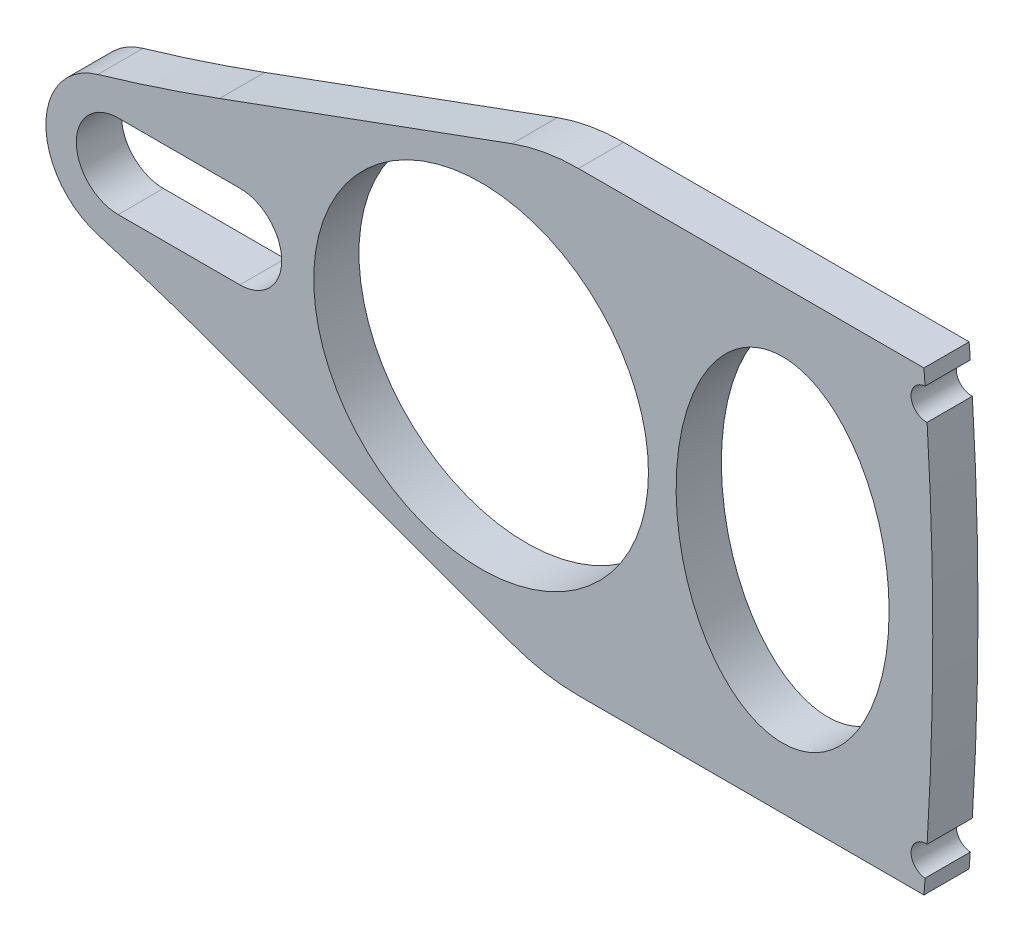
ISO-10303-21;
HEADER;
FILE_DESCRIPTION(('STEP AP214'),'2;1');
FILE_NAME('part.step','',(''),(''),'','','');
FILE_SCHEMA(('AUTOMOTIVE_DESIGN { 1 0 10303 214 1 1 1 1 }'));
ENDSEC;
DATA;
#1=APPLICATION_CONTEXT('core data for automotive mechanical design processes');
#2=APPLICATION_PROTOCOL_DEFINITION('international standard','automotive_design',2000,#1);
#3=PRODUCT_CONTEXT('',#1,'mechanical');
#4=PRODUCT('Part','Part','',(#3));
#5=PRODUCT_RELATED_PRODUCT_CATEGORY('part','',(#4));
#6=PRODUCT_DEFINITION_FORMATION('','',#4);
#7=PRODUCT_DEFINITION_CONTEXT('part definition',#1,'design');
#8=PRODUCT_DEFINITION('design','',#6,#7);
#9=PRODUCT_DEFINITION_SHAPE('','',#8);
#10=(LENGTH_UNIT() NAMED_UNIT(*) SI_UNIT(.MILLI.,.METRE.));
#11=(NAMED_UNIT(*) PLANE_ANGLE_UNIT() SI_UNIT($,.RADIAN.));
#12=(NAMED_UNIT(*) SI_UNIT($,.STERADIAN.) SOLID_ANGLE_UNIT());
#13=UNCERTAINTY_MEASURE_WITH_UNIT(LENGTH_MEASURE(1.E-05),#10,'distance_accuracy_value','');
#14=(GEOMETRIC_REPRESENTATION_CONTEXT(3) GLOBAL_UNCERTAINTY_ASSIGNED_CONTEXT((#13)) GLOBAL_UNIT_ASSIGNED_CONTEXT((#10,
#11,#12)) REPRESENTATION_CONTEXT('',''));
#15=CARTESIAN_POINT('',(0.,0.,0.));
#16=DIRECTION('',(0.,0.,1.));
#17=DIRECTION('',(1.,0.,0.));
#18=AXIS2_PLACEMENT_3D('',#15,#16,#17);
#19=CARTESIAN_POINT('',(-7.77682333330338,-8.0786097532659,3.));
#20=DIRECTION('',(0.,0.,1.));
#21=DIRECTION('',(1.,0.,0.));
#22=AXIS2_PLACEMENT_3D('',#19,#20,#21);
#23=PLANE('',#22);
#24=CARTESIAN_POINT('',(-37.3047240677879,5.04690601078956,3.));
#25=DIRECTION('',(0.,0.,1.));
#26=DIRECTION('',(1.,0.,0.));
#27=AXIS2_PLACEMENT_3D('',#24,#25,#26);
#28=CIRCLE('',#27,11.101085899709);
#29=CARTESIAN_POINT('',(-26.2036381680789,5.04690601078956,3.));
#30=VERTEX_POINT('',#29);
#31=EDGE_CURVE('E449',#30,#30,#28,.T.);
#32=ORIENTED_EDGE('',*,*,#31,.F.);
#33=EDGE_LOOP('',(#32));
#34=FACE_BOUND('',#33,.T.);
#35=CARTESIAN_POINT('',(-7.77682333330338,-8.0786097532659,3.));
#36=DIRECTION('',(0.,0.,-1.));
#37=DIRECTION('',(1.,0.,0.));
#38=AXIS2_PLACEMENT_3D('',#35,#36,#37);
#39=CIRCLE('',#38,1.00918962724762);
#40=CARTESIAN_POINT('',(-7.85750176930204,-9.08456934177281,3.));
#41=VERTEX_POINT('',#40);
#42=CARTESIAN_POINT('',(-7.72211277540641,-7.07090421165226,3.));
#43=VERTEX_POINT('',#42);
#44=EDGE_CURVE('E360',#41,#43,#39,.T.);
#45=ORIENTED_EDGE('',*,*,#44,.T.);
#46=CARTESIAN_POINT('',(-202.995006498992,5.04690601078679,3.));
#47=DIRECTION('',(0.,0.,1.));
#48=DIRECTION('',(1.,0.,0.));
#49=AXIS2_PLACEMENT_3D('',#46,#47,#48);
#50=CIRCLE('',#49,195.64852247786);
#51=CARTESIAN_POINT('',(-7.72211277540656,17.1647162332286,3.));
#52=VERTEX_POINT('',#51);
#53=EDGE_CURVE('E439',#43,#52,#50,.T.);
#54=ORIENTED_EDGE('',*,*,#53,.T.);
#55=CARTESIAN_POINT('',(-7.77682333329522,18.1724217748454,3.));
#56=DIRECTION('',(0.,0.,-1.));
#57=DIRECTION('',(1.,0.,0.));
#58=AXIS2_PLACEMENT_3D('',#55,#56,#57);
#59=CIRCLE('',#58,1.00918962725036);
#60=CARTESIAN_POINT('',(-7.85750176930147,19.178381363334,3.));
#61=VERTEX_POINT('',#60);
#62=EDGE_CURVE('E436',#52,#61,#59,.T.);
#63=ORIENTED_EDGE('',*,*,#62,.T.);
#64=CARTESIAN_POINT('',(-202.995006498992,5.04690601077163,3.));
#65=DIRECTION('',(0.,0.,1.));
#66=DIRECTION('',(1.,0.,0.));
#67=AXIS2_PLACEMENT_3D('',#64,#65,#66);
#68=CIRCLE('',#67,195.648522477861);
#69=CARTESIAN_POINT('',(-7.93299068241115,20.1847504194836,3.));
#70=VERTEX_POINT('',#69);
#71=EDGE_CURVE('E316',#61,#70,#68,.T.);
#72=ORIENTED_EDGE('',*,*,#71,.T.);
#73=DIRECTION('',(-1.,0.,0.));
#74=VECTOR('',#73,1.);
#75=CARTESIAN_POINT('',(-7.93299068241115,20.1847504194836,3.));
#76=LINE('',#75,#74);
#77=CARTESIAN_POINT('',(-30.8487465878263,20.1847504194836,3.));
#78=VERTEX_POINT('',#77);
#79=EDGE_CURVE('E431',#70,#78,#76,.T.);
#80=ORIENTED_EDGE('',*,*,#79,.T.);
#81=CARTESIAN_POINT('',(-30.8487465878263,7.36804215345589,3.));
#82=DIRECTION('',(0.,0.,1.));
#83=DIRECTION('',(1.,0.,0.));
#84=AXIS2_PLACEMENT_3D('',#81,#82,#83);
#85=CIRCLE('',#84,12.8167082660278);
#86=CARTESIAN_POINT('',(-35.2546423511581,19.4036598484111,3.));
#87=VERTEX_POINT('',#86);
#88=EDGE_CURVE('E428',#78,#87,#85,.T.);
#89=ORIENTED_EDGE('',*,*,#88,.T.);
#90=DIRECTION('',(-0.939056850256716,-0.343761882683254,0.));
#91=VECTOR('',#90,1.);
#92=CARTESIAN_POINT('',(-35.2546423511581,19.4036598484111,3.));
#93=LINE('',#92,#91);
#94=CARTESIAN_POINT('',(-54.6534028909149,12.3023278651074,3.));
#95=VERTEX_POINT('',#94);
#96=EDGE_CURVE('E425',#87,#95,#93,.T.);
#97=ORIENTED_EDGE('',*,*,#96,.T.);
#98=CARTESIAN_POINT('',(-98.7123605242326,132.658504814659,3.));
#99=DIRECTION('',(0.,0.,-1.));
#100=DIRECTION('',(1.,0.,0.));
#101=AXIS2_PLACEMENT_3D('',#98,#99,#100);
#102=CIRCLE('',#101,128.167082660277);
#103=CARTESIAN_POINT('',(-62.7242529820219,9.64770369062547,3.));
#104=VERTEX_POINT('',#103);
#105=EDGE_CURVE('E422',#95,#104,#102,.T.);
#106=ORIENTED_EDGE('',*,*,#105,.T.);
#107=CARTESIAN_POINT('',(-61.3782410857581,5.04690601078956,3.));
#108=DIRECTION('',(0.,0.,1.));
#109=DIRECTION('',(1.,0.,0.));
#110=AXIS2_PLACEMENT_3D('',#107,#108,#109);
#111=CIRCLE('',#110,4.79365072941982);
#112=CARTESIAN_POINT('',(-62.7242529820219,0.446108330953654,3.));
#113=VERTEX_POINT('',#112);
#114=EDGE_CURVE('E419',#104,#113,#111,.T.);
#115=ORIENTED_EDGE('',*,*,#114,.T.);
#116=CARTESIAN_POINT('',(-98.7123605242318,-122.56469279308,3.));
#117=DIRECTION('',(0.,0.,-1.));
#118=DIRECTION('',(1.,0.,0.));
#119=AXIS2_PLACEMENT_3D('',#116,#117,#118);
#120=CIRCLE('',#119,128.167082660277);
#121=CARTESIAN_POINT('',(-54.6534028909135,-2.20851584352876,3.));
#122=VERTEX_POINT('',#121);
#123=EDGE_CURVE('E416',#113,#122,#120,.T.);
#124=ORIENTED_EDGE('',*,*,#123,.T.);
#125=DIRECTION('',(0.939056850256712,-0.343761882683264,0.));
#126=VECTOR('',#125,1.);
#127=CARTESIAN_POINT('',(-54.6534028909135,-2.20851584352876,3.));
#128=LINE('',#127,#126);
#129=CARTESIAN_POINT('',(-35.2546423511581,-9.30984782683213,3.));
#130=VERTEX_POINT('',#129);
#131=EDGE_CURVE('E413',#122,#130,#128,.T.);
#132=ORIENTED_EDGE('',*,*,#131,.T.);
#133=CARTESIAN_POINT('',(-30.8487465878263,2.72576986812301,3.));
#134=DIRECTION('',(0.,0.,1.));
#135=DIRECTION('',(1.,0.,0.));
#136=AXIS2_PLACEMENT_3D('',#133,#134,#135);
#137=CIRCLE('',#136,12.8167082660277);
#138=CARTESIAN_POINT('',(-30.8487465878263,-10.0909383979047,3.));
#139=VERTEX_POINT('',#138);
#140=EDGE_CURVE('E410',#130,#139,#137,.T.);
#141=ORIENTED_EDGE('',*,*,#140,.T.);
#142=DIRECTION('',(1.,0.,0.));
#143=VECTOR('',#142,1.);
#144=CARTESIAN_POINT('',(-30.8487465878263,-10.0909383979047,3.));
#145=LINE('',#144,#143);
#146=CARTESIAN_POINT('',(-7.93299068241127,-10.0909383979048,3.));
#147=VERTEX_POINT('',#146);
#148=EDGE_CURVE('E407',#139,#147,#145,.T.);
#149=ORIENTED_EDGE('',*,*,#148,.T.);
#150=CARTESIAN_POINT('',(-202.995006498992,5.04690601078939,3.));
#151=DIRECTION('',(0.,0.,1.));
#152=DIRECTION('',(1.,0.,0.));
#153=AXIS2_PLACEMENT_3D('',#150,#151,#152);
#154=CIRCLE('',#153,195.64852247786);
#155=EDGE_CURVE('E366',#147,#41,#154,.T.);
#156=ORIENTED_EDGE('',*,*,#155,.T.);
#157=EDGE_LOOP('',(#45,#54,#63,#72,#80,#89,#97,#106,#115,#124,#132,#141,#149,#156));
#158=FACE_BOUND('',#157,.T.);
#159=CARTESIAN_POINT('',(-17.3047240677879,5.04690601078956,3.));
#160=DIRECTION('',(0.,0.,1.));
#161=DIRECTION('',(0.,-1.,0.));
#162=AXIS2_PLACEMENT_3D('',#159,#160,#161);
#163=ELLIPSE('',#162,11.101085899709,7.06432739072393);
#164=CARTESIAN_POINT('',(-17.3047240677879,-6.05417988891948,3.));
#165=VERTEX_POINT('',#164);
#166=EDGE_CURVE('E219',#165,#165,#163,.T.);
#167=ORIENTED_EDGE('',*,*,#166,.F.);
#168=EDGE_LOOP('',(#167));
#169=FACE_BOUND('',#168,.T.);
#170=DIRECTION('',(-1.,0.,0.));
#171=VECTOR('',#170,1.);
#172=CARTESIAN_POINT('',(-61.3782410857581,7.82217748571684,3.));
#173=LINE('',#172,#171);
#174=CARTESIAN_POINT('',(-53.3047240677879,7.82217748571684,3.));
#175=VERTEX_POINT('',#174);
#176=CARTESIAN_POINT('',(-61.3782410857581,7.82217748571682,3.));
#177=VERTEX_POINT('',#176);
#178=EDGE_CURVE('E180',#175,#177,#173,.T.);
#179=ORIENTED_EDGE('',*,*,#178,.F.);
#180=CARTESIAN_POINT('',(-53.3047240677879,5.04690601078958,3.));
#181=DIRECTION('',(0.,0.,1.));
#182=DIRECTION('',(1.,0.,0.));
#183=AXIS2_PLACEMENT_3D('',#180,#181,#182);
#184=CIRCLE('',#183,2.77527147492728);
#185=CARTESIAN_POINT('',(-53.3047240677879,2.27163453586227,3.));
#186=VERTEX_POINT('',#185);
#187=EDGE_CURVE('E171',#186,#175,#184,.T.);
#188=ORIENTED_EDGE('',*,*,#187,.F.);
#189=DIRECTION('',(1.,0.,0.));
#190=VECTOR('',#189,1.);
#191=CARTESIAN_POINT('',(-53.3047240677879,2.27163453586227,3.));
#192=LINE('',#191,#190);
#193=CARTESIAN_POINT('',(-61.3782410857581,2.27163453586227,3.));
#194=VERTEX_POINT('',#193);
#195=EDGE_CURVE('E197',#194,#186,#192,.T.);
#196=ORIENTED_EDGE('',*,*,#195,.F.);
#197=CARTESIAN_POINT('',(-61.3782410857581,5.04690601078953,3.));
#198=DIRECTION('',(0.,0.,1.));
#199=DIRECTION('',(1.,0.,0.));
#200=AXIS2_PLACEMENT_3D('',#197,#198,#199);
#201=CIRCLE('',#200,2.77527147492728);
#202=EDGE_CURVE('E193',#177,#194,#201,.T.);
#203=ORIENTED_EDGE('',*,*,#202,.F.);
#204=EDGE_LOOP('',(#179,#188,#196,#203));
#205=FACE_BOUND('',#204,.T.);
#206=ADVANCED_FACE('F45',(#34,#158,#169,#205),#23,.T.);
#207=CARTESIAN_POINT('',(-7.77682333330338,-8.0786097532659,0.));
#208=DIRECTION('',(0.,0.,1.));
#209=DIRECTION('',(1.,0.,0.));
#210=AXIS2_PLACEMENT_3D('',#207,#208,#209);
#211=PLANE('',#210);
#212=CARTESIAN_POINT('',(-17.3047240677879,5.04690601078956,0.));
#213=DIRECTION('',(0.,0.,1.));
#214=DIRECTION('',(0.,-1.,0.));
#215=AXIS2_PLACEMENT_3D('',#212,#213,#214);
#216=ELLIPSE('',#215,11.101085899709,7.06432739072393);
#217=CARTESIAN_POINT('',(-17.3047240677879,-6.05417988891948,0.));
#218=VERTEX_POINT('',#217);
#219=EDGE_CURVE('E189',#218,#218,#216,.T.);
#220=ORIENTED_EDGE('',*,*,#219,.T.);
#221=EDGE_LOOP('',(#220));
#222=FACE_BOUND('',#221,.T.);
#223=CARTESIAN_POINT('',(-37.3047240677879,5.04690601078956,0.));
#224=DIRECTION('',(0.,0.,1.));
#225=DIRECTION('',(1.,0.,0.));
#226=AXIS2_PLACEMENT_3D('',#223,#224,#225);
#227=CIRCLE('',#226,11.101085899709);
#228=CARTESIAN_POINT('',(-26.2036381680789,5.04690601078956,0.));
#229=VERTEX_POINT('',#228);
#230=EDGE_CURVE('E224',#229,#229,#227,.T.);
#231=ORIENTED_EDGE('',*,*,#230,.T.);
#232=EDGE_LOOP('',(#231));
#233=FACE_BOUND('',#232,.T.);
#234=CARTESIAN_POINT('',(-202.995006498992,5.04690601078679,0.));
#235=DIRECTION('',(0.,0.,1.));
#236=DIRECTION('',(1.,0.,0.));
#237=AXIS2_PLACEMENT_3D('',#234,#235,#236);
#238=CIRCLE('',#237,195.64852247786);
#239=CARTESIAN_POINT('',(-7.72211277540641,-7.07090421165226,0.));
#240=VERTEX_POINT('',#239);
#241=CARTESIAN_POINT('',(-7.72211277540656,17.1647162332286,0.));
#242=VERTEX_POINT('',#241);
#243=EDGE_CURVE('E312',#240,#242,#238,.T.);
#244=ORIENTED_EDGE('',*,*,#243,.F.);
#245=CARTESIAN_POINT('',(-7.77682333330339,-8.0786097532659,0.));
#246=DIRECTION('',(0.,0.,-1.));
#247=DIRECTION('',(1.,0.,0.));
#248=AXIS2_PLACEMENT_3D('',#245,#246,#247);
#249=CIRCLE('',#248,1.00918962724762);
#250=CARTESIAN_POINT('',(-7.85750176930204,-9.08456934177281,0.));
#251=VERTEX_POINT('',#250);
#252=EDGE_CURVE('E357',#251,#240,#249,.T.);
#253=ORIENTED_EDGE('',*,*,#252,.F.);
#254=CARTESIAN_POINT('',(-202.995006498992,5.04690601078939,0.));
#255=DIRECTION('',(0.,0.,1.));
#256=DIRECTION('',(1.,0.,0.));
#257=AXIS2_PLACEMENT_3D('',#254,#255,#256);
#258=CIRCLE('',#257,195.64852247786);
#259=CARTESIAN_POINT('',(-7.93299068241127,-10.0909383979048,0.));
#260=VERTEX_POINT('',#259);
#261=EDGE_CURVE('E354',#260,#251,#258,.T.);
#262=ORIENTED_EDGE('',*,*,#261,.F.);
#263=DIRECTION('',(1.,0.,0.));
#264=VECTOR('',#263,1.);
#265=CARTESIAN_POINT('',(-30.8487465878263,-10.0909383979047,0.));
#266=LINE('',#265,#264);
#267=CARTESIAN_POINT('',(-30.8487465878263,-10.0909383979047,0.));
#268=VERTEX_POINT('',#267);
#269=EDGE_CURVE('E351',#268,#260,#266,.T.);
#270=ORIENTED_EDGE('',*,*,#269,.F.);
#271=CARTESIAN_POINT('',(-30.8487465878263,2.72576986812301,0.));
#272=DIRECTION('',(0.,0.,1.));
#273=DIRECTION('',(1.,0.,0.));
#274=AXIS2_PLACEMENT_3D('',#271,#272,#273);
#275=CIRCLE('',#274,12.8167082660277);
#276=CARTESIAN_POINT('',(-35.2546423511581,-9.30984782683213,0.));
#277=VERTEX_POINT('',#276);
#278=EDGE_CURVE('E348',#277,#268,#275,.T.);
#279=ORIENTED_EDGE('',*,*,#278,.F.);
#280=DIRECTION('',(0.939056850256712,-0.343761882683264,0.));
#281=VECTOR('',#280,1.);
#282=CARTESIAN_POINT('',(-54.6534028909135,-2.20851584352876,0.));
#283=LINE('',#282,#281);
#284=CARTESIAN_POINT('',(-54.6534028909135,-2.20851584352876,0.));
#285=VERTEX_POINT('',#284);
#286=EDGE_CURVE('E345',#285,#277,#283,.T.);
#287=ORIENTED_EDGE('',*,*,#286,.F.);
#288=CARTESIAN_POINT('',(-98.7123605242318,-122.56469279308,0.));
#289=DIRECTION('',(0.,0.,-1.));
#290=DIRECTION('',(1.,0.,0.));
#291=AXIS2_PLACEMENT_3D('',#288,#289,#290);
#292=CIRCLE('',#291,128.167082660277);
#293=CARTESIAN_POINT('',(-62.7242529820219,0.446108330953654,0.));
#294=VERTEX_POINT('',#293);
#295=EDGE_CURVE('E342',#294,#285,#292,.T.);
#296=ORIENTED_EDGE('',*,*,#295,.F.);
#297=CARTESIAN_POINT('',(-61.3782410857581,5.04690601078956,0.));
#298=DIRECTION('',(0.,0.,1.));
#299=DIRECTION('',(1.,0.,0.));
#300=AXIS2_PLACEMENT_3D('',#297,#298,#299);
#301=CIRCLE('',#300,4.79365072941982);
#302=CARTESIAN_POINT('',(-62.7242529820219,9.64770369062547,0.));
#303=VERTEX_POINT('',#302);
#304=EDGE_CURVE('E339',#303,#294,#301,.T.);
#305=ORIENTED_EDGE('',*,*,#304,.F.);
#306=CARTESIAN_POINT('',(-98.7123605242326,132.658504814659,0.));
#307=DIRECTION('',(0.,0.,-1.));
#308=DIRECTION('',(1.,0.,0.));
#309=AXIS2_PLACEMENT_3D('',#306,#307,#308);
#310=CIRCLE('',#309,128.167082660277);
#311=CARTESIAN_POINT('',(-54.6534028909149,12.3023278651074,0.));
#312=VERTEX_POINT('',#311);
#313=EDGE_CURVE('E336',#312,#303,#310,.T.);
#314=ORIENTED_EDGE('',*,*,#313,.F.);
#315=DIRECTION('',(-0.939056850256716,-0.343761882683254,0.));
#316=VECTOR('',#315,1.);
#317=CARTESIAN_POINT('',(-35.2546423511581,19.4036598484111,0.));
#318=LINE('',#317,#316);
#319=CARTESIAN_POINT('',(-35.2546423511581,19.4036598484111,0.));
#320=VERTEX_POINT('',#319);
#321=EDGE_CURVE('E333',#320,#312,#318,.T.);
#322=ORIENTED_EDGE('',*,*,#321,.F.);
#323=CARTESIAN_POINT('',(-30.8487465878263,7.36804215345589,0.));
#324=DIRECTION('',(0.,0.,1.));
#325=DIRECTION('',(1.,0.,0.));
#326=AXIS2_PLACEMENT_3D('',#323,#324,#325);
#327=CIRCLE('',#326,12.8167082660278);
#328=CARTESIAN_POINT('',(-30.8487465878263,20.1847504194836,0.));
#329=VERTEX_POINT('',#328);
#330=EDGE_CURVE('E327',#329,#320,#327,.T.);
#331=ORIENTED_EDGE('',*,*,#330,.F.);
#332=DIRECTION('',(-1.,0.,0.));
#333=VECTOR('',#332,1.);
#334=CARTESIAN_POINT('',(-7.93299068241115,20.1847504194836,0.));
#335=LINE('',#334,#333);
#336=CARTESIAN_POINT('',(-7.93299068241115,20.1847504194836,0.));
#337=VERTEX_POINT('',#336);
#338=EDGE_CURVE('E323',#337,#329,#335,.T.);
#339=ORIENTED_EDGE('',*,*,#338,.F.);
#340=CARTESIAN_POINT('',(-202.995006498992,5.04690601077163,0.));
#341=DIRECTION('',(0.,0.,1.));
#342=DIRECTION('',(1.,0.,0.));
#343=AXIS2_PLACEMENT_3D('',#340,#341,#342);
#344=CIRCLE('',#343,195.648522477861);
#345=CARTESIAN_POINT('',(-7.85750176930147,19.178381363334,0.));
#346=VERTEX_POINT('',#345);
#347=EDGE_CURVE('E311',#346,#337,#344,.T.);
#348=ORIENTED_EDGE('',*,*,#347,.F.);
#349=CARTESIAN_POINT('',(-7.77682333329873,18.1724217748274,0.));
#350=DIRECTION('',(0.,0.,-1.));
#351=DIRECTION('',(1.,0.,0.));
#352=AXIS2_PLACEMENT_3D('',#349,#350,#351);
#353=CIRCLE('',#352,1.00918962724768);
#354=EDGE_CURVE('E300',#242,#346,#353,.T.);
#355=ORIENTED_EDGE('',*,*,#354,.F.);
#356=EDGE_LOOP('',(#244,#253,#262,#270,#279,#287,#296,#305,#314,#322,#331,#339,#348,#355));
#357=FACE_BOUND('',#356,.T.);
#358=CARTESIAN_POINT('',(-53.3047240677879,5.04690601078958,0.));
#359=DIRECTION('',(0.,0.,1.));
#360=DIRECTION('',(1.,0.,0.));
#361=AXIS2_PLACEMENT_3D('',#358,#359,#360);
#362=CIRCLE('',#361,2.77527147492728);
#363=CARTESIAN_POINT('',(-53.3047240677879,2.27163453586227,0.));
#364=VERTEX_POINT('',#363);
#365=CARTESIAN_POINT('',(-53.3047240677879,7.82217748571684,0.));
#366=VERTEX_POINT('',#365);
#367=EDGE_CURVE('E69',#364,#366,#362,.T.);
#368=ORIENTED_EDGE('',*,*,#367,.T.);
#369=DIRECTION('',(-1.,0.,0.));
#370=VECTOR('',#369,1.);
#371=CARTESIAN_POINT('',(-61.3782410857581,7.82217748571684,0.));
#372=LINE('',#371,#370);
#373=CARTESIAN_POINT('',(-61.3782410857581,7.82217748571682,0.));
#374=VERTEX_POINT('',#373);
#375=EDGE_CURVE('E187',#366,#374,#372,.T.);
#376=ORIENTED_EDGE('',*,*,#375,.T.);
#377=CARTESIAN_POINT('',(-61.3782410857581,5.04690601078953,0.));
#378=DIRECTION('',(0.,0.,1.));
#379=DIRECTION('',(1.,0.,0.));
#380=AXIS2_PLACEMENT_3D('',#377,#378,#379);
#381=CIRCLE('',#380,2.77527147492728);
#382=CARTESIAN_POINT('',(-61.3782410857581,2.27163453586227,0.));
#383=VERTEX_POINT('',#382);
#384=EDGE_CURVE('E206',#374,#383,#381,.T.);
#385=ORIENTED_EDGE('',*,*,#384,.T.);
#386=DIRECTION('',(1.,0.,0.));
#387=VECTOR('',#386,1.);
#388=CARTESIAN_POINT('',(-53.3047240677879,2.27163453586227,0.));
#389=LINE('',#388,#387);
#390=EDGE_CURVE('E181',#383,#364,#389,.T.);
#391=ORIENTED_EDGE('',*,*,#390,.T.);
#392=EDGE_LOOP('',(#368,#376,#385,#391));
#393=FACE_BOUND('',#392,.T.);
#394=ADVANCED_FACE('F240',(#222,#233,#357,#393),#211,.F.);
#395=CARTESIAN_POINT('',(-202.995006498992,5.04690601078679,3.));
#396=DIRECTION('',(0.,0.,-1.));
#397=DIRECTION('',(-1.,0.,0.));
#398=AXIS2_PLACEMENT_3D('',#395,#396,#397);
#399=CYLINDRICAL_SURFACE('',#398,195.64852247786);
#400=ORIENTED_EDGE('',*,*,#243,.T.);
#401=DIRECTION('',(0.,0.,-1.));
#402=VECTOR('',#401,1.);
#403=CARTESIAN_POINT('',(-7.72211277540656,17.1647162332286,3.));
#404=LINE('',#403,#402);
#405=EDGE_CURVE('E54',#52,#242,#404,.T.);
#406=ORIENTED_EDGE('',*,*,#405,.F.);
#407=ORIENTED_EDGE('',*,*,#53,.F.);
#408=DIRECTION('',(0.,0.,-1.));
#409=VECTOR('',#408,1.);
#410=CARTESIAN_POINT('',(-7.72211277540641,-7.07090421165226,3.));
#411=LINE('',#410,#409);
#412=EDGE_CURVE('E11',#43,#240,#411,.T.);
#413=ORIENTED_EDGE('',*,*,#412,.T.);
#414=EDGE_LOOP('',(#400,#406,#407,#413));
#415=FACE_BOUND('',#414,.T.);
#416=ADVANCED_FACE('F47',(#415),#399,.T.);
#417=CARTESIAN_POINT('',(-7.77682333329873,18.1724217748274,3.));
#418=DIRECTION('',(0.,0.,-1.));
#419=DIRECTION('',(-1.,0.,0.));
#420=AXIS2_PLACEMENT_3D('',#417,#418,#419);
#421=CYLINDRICAL_SURFACE('',#420,1.00918962724768);
#422=ORIENTED_EDGE('',*,*,#354,.T.);
#423=DIRECTION('',(0.,0.,-1.));
#424=VECTOR('',#423,1.);
#425=CARTESIAN_POINT('',(-7.85750176930147,19.178381363334,3.));
#426=LINE('',#425,#424);
#427=EDGE_CURVE('E303',#61,#346,#426,.T.);
#428=ORIENTED_EDGE('',*,*,#427,.F.);
#429=ORIENTED_EDGE('',*,*,#62,.F.);
#430=ORIENTED_EDGE('',*,*,#405,.T.);
#431=EDGE_LOOP('',(#422,#428,#429,#430));
#432=FACE_BOUND('',#431,.T.);
#433=ADVANCED_FACE('F290',(#432),#421,.F.);
#434=CARTESIAN_POINT('',(-202.995006498992,5.04690601077163,3.));
#435=DIRECTION('',(0.,0.,-1.));
#436=DIRECTION('',(-1.,0.,0.));
#437=AXIS2_PLACEMENT_3D('',#434,#435,#436);
#438=CYLINDRICAL_SURFACE('',#437,195.648522477861);
#439=ORIENTED_EDGE('',*,*,#347,.T.);
#440=DIRECTION('',(0.,0.,-1.));
#441=VECTOR('',#440,1.);
#442=CARTESIAN_POINT('',(-7.93299068241115,20.1847504194836,3.));
#443=LINE('',#442,#441);
#444=EDGE_CURVE('E318',#70,#337,#443,.T.);
#445=ORIENTED_EDGE('',*,*,#444,.F.);
#446=ORIENTED_EDGE('',*,*,#71,.F.);
#447=ORIENTED_EDGE('',*,*,#427,.T.);
#448=EDGE_LOOP('',(#439,#445,#446,#447));
#449=FACE_BOUND('',#448,.T.);
#450=ADVANCED_FACE('F287',(#449),#438,.T.);
#451=CARTESIAN_POINT('',(-7.93299068241115,20.1847504194836,3.));
#452=DIRECTION('',(0.,-1.,0.));
#453=DIRECTION('',(0.,0.,-1.));
#454=AXIS2_PLACEMENT_3D('',#451,#452,#453);
#455=PLANE('',#454);
#456=ORIENTED_EDGE('',*,*,#338,.T.);
#457=DIRECTION('',(0.,0.,-1.));
#458=VECTOR('',#457,1.);
#459=CARTESIAN_POINT('',(-30.8487465878263,20.1847504194836,3.));
#460=LINE('',#459,#458);
#461=EDGE_CURVE('E398',#78,#329,#460,.T.);
#462=ORIENTED_EDGE('',*,*,#461,.F.);
#463=ORIENTED_EDGE('',*,*,#79,.F.);
#464=ORIENTED_EDGE('',*,*,#444,.T.);
#465=EDGE_LOOP('',(#456,#462,#463,#464));
#466=FACE_BOUND('',#465,.T.);
#467=ADVANCED_FACE('F283',(#466),#455,.F.);
#468=CARTESIAN_POINT('',(-30.8487465878263,7.36804215345589,3.));
#469=DIRECTION('',(0.,0.,-1.));
#470=DIRECTION('',(-1.,0.,0.));
#471=AXIS2_PLACEMENT_3D('',#468,#469,#470);
#472=CYLINDRICAL_SURFACE('',#471,12.8167082660278);
#473=ORIENTED_EDGE('',*,*,#330,.T.);
#474=DIRECTION('',(0.,0.,-1.));
#475=VECTOR('',#474,1.);
#476=CARTESIAN_POINT('',(-35.2546423511581,19.4036598484111,3.));
#477=LINE('',#476,#475);
#478=EDGE_CURVE('E394',#87,#320,#477,.T.);
#479=ORIENTED_EDGE('',*,*,#478,.F.);
#480=ORIENTED_EDGE('',*,*,#88,.F.);
#481=ORIENTED_EDGE('',*,*,#461,.T.);
#482=EDGE_LOOP('',(#473,#479,#480,#481));
#483=FACE_BOUND('',#482,.T.);
#484=ADVANCED_FACE('F279',(#483),#472,.T.);
#485=CARTESIAN_POINT('',(-35.2546423511581,19.4036598484111,3.));
#486=DIRECTION('',(0.343761882683254,-0.939056850256716,0.));
#487=DIRECTION('',(0.939056850256716,0.343761882683254,0.));
#488=AXIS2_PLACEMENT_3D('',#485,#486,#487);
#489=PLANE('',#488);
#490=ORIENTED_EDGE('',*,*,#321,.T.);
#491=DIRECTION('',(0.,0.,-1.));
#492=VECTOR('',#491,1.);
#493=CARTESIAN_POINT('',(-54.6534028909149,12.3023278651074,3.));
#494=LINE('',#493,#492);
#495=EDGE_CURVE('E390',#95,#312,#494,.T.);
#496=ORIENTED_EDGE('',*,*,#495,.F.);
#497=ORIENTED_EDGE('',*,*,#96,.F.);
#498=ORIENTED_EDGE('',*,*,#478,.T.);
#499=EDGE_LOOP('',(#490,#496,#497,#498));
#500=FACE_BOUND('',#499,.T.);
#501=ADVANCED_FACE('F275',(#500),#489,.F.);
#502=CARTESIAN_POINT('',(-98.7123605242326,132.658504814659,3.));
#503=DIRECTION('',(0.,0.,-1.));
#504=DIRECTION('',(-1.,0.,0.));
#505=AXIS2_PLACEMENT_3D('',#502,#503,#504);
#506=CYLINDRICAL_SURFACE('',#505,128.167082660277);
#507=ORIENTED_EDGE('',*,*,#313,.T.);
#508=DIRECTION('',(0.,0.,-1.));
#509=VECTOR('',#508,1.);
#510=CARTESIAN_POINT('',(-62.7242529820219,9.64770369062547,3.));
#511=LINE('',#510,#509);
#512=EDGE_CURVE('E386',#104,#303,#511,.T.);
#513=ORIENTED_EDGE('',*,*,#512,.F.);
#514=ORIENTED_EDGE('',*,*,#105,.F.);
#515=ORIENTED_EDGE('',*,*,#495,.T.);
#516=EDGE_LOOP('',(#507,#513,#514,#515));
#517=FACE_BOUND('',#516,.T.);
#518=ADVANCED_FACE('F271',(#517),#506,.F.);
#519=CARTESIAN_POINT('',(-61.3782410857581,5.04690601078956,3.));
#520=DIRECTION('',(0.,0.,-1.));
#521=DIRECTION('',(-1.,0.,0.));
#522=AXIS2_PLACEMENT_3D('',#519,#520,#521);
#523=CYLINDRICAL_SURFACE('',#522,4.79365072941982);
#524=ORIENTED_EDGE('',*,*,#304,.T.);
#525=DIRECTION('',(0.,0.,-1.));
#526=VECTOR('',#525,1.);
#527=CARTESIAN_POINT('',(-62.7242529820219,0.446108330953654,3.));
#528=LINE('',#527,#526);
#529=EDGE_CURVE('E382',#113,#294,#528,.T.);
#530=ORIENTED_EDGE('',*,*,#529,.F.);
#531=ORIENTED_EDGE('',*,*,#114,.F.);
#532=ORIENTED_EDGE('',*,*,#512,.T.);
#533=EDGE_LOOP('',(#524,#530,#531,#532));
#534=FACE_BOUND('',#533,.T.);
#535=ADVANCED_FACE('F267',(#534),#523,.T.);
#536=CARTESIAN_POINT('',(-98.7123605242318,-122.56469279308,3.));
#537=DIRECTION('',(0.,0.,-1.));
#538=DIRECTION('',(-1.,0.,0.));
#539=AXIS2_PLACEMENT_3D('',#536,#537,#538);
#540=CYLINDRICAL_SURFACE('',#539,128.167082660277);
#541=ORIENTED_EDGE('',*,*,#295,.T.);
#542=DIRECTION('',(0.,0.,-1.));
#543=VECTOR('',#542,1.);
#544=CARTESIAN_POINT('',(-54.6534028909135,-2.20851584352876,3.));
#545=LINE('',#544,#543);
#546=EDGE_CURVE('E378',#122,#285,#545,.T.);
#547=ORIENTED_EDGE('',*,*,#546,.F.);
#548=ORIENTED_EDGE('',*,*,#123,.F.);
#549=ORIENTED_EDGE('',*,*,#529,.T.);
#550=EDGE_LOOP('',(#541,#547,#548,#549));
#551=FACE_BOUND('',#550,.T.);
#552=ADVANCED_FACE('F263',(#551),#540,.F.);
#553=CARTESIAN_POINT('',(-54.6534028909135,-2.20851584352876,3.));
#554=DIRECTION('',(0.343761882683264,0.939056850256713,0.));
#555=DIRECTION('',(-0.939056850256713,0.343761882683264,0.));
#556=AXIS2_PLACEMENT_3D('',#553,#554,#555);
#557=PLANE('',#556);
#558=ORIENTED_EDGE('',*,*,#286,.T.);
#559=DIRECTION('',(0.,0.,-1.));
#560=VECTOR('',#559,1.);
#561=CARTESIAN_POINT('',(-35.2546423511581,-9.30984782683213,3.));
#562=LINE('',#561,#560);
#563=EDGE_CURVE('E374',#130,#277,#562,.T.);
#564=ORIENTED_EDGE('',*,*,#563,.F.);
#565=ORIENTED_EDGE('',*,*,#131,.F.);
#566=ORIENTED_EDGE('',*,*,#546,.T.);
#567=EDGE_LOOP('',(#558,#564,#565,#566));
#568=FACE_BOUND('',#567,.T.);
#569=ADVANCED_FACE('F259',(#568),#557,.F.);
#570=CARTESIAN_POINT('',(-30.8487465878263,2.72576986812301,3.));
#571=DIRECTION('',(0.,0.,-1.));
#572=DIRECTION('',(-1.,0.,0.));
#573=AXIS2_PLACEMENT_3D('',#570,#571,#572);
#574=CYLINDRICAL_SURFACE('',#573,12.8167082660277);
#575=ORIENTED_EDGE('',*,*,#278,.T.);
#576=DIRECTION('',(0.,0.,-1.));
#577=VECTOR('',#576,1.);
#578=CARTESIAN_POINT('',(-30.8487465878263,-10.0909383979047,3.));
#579=LINE('',#578,#577);
#580=EDGE_CURVE('E370',#139,#268,#579,.T.);
#581=ORIENTED_EDGE('',*,*,#580,.F.);
#582=ORIENTED_EDGE('',*,*,#140,.F.);
#583=ORIENTED_EDGE('',*,*,#563,.T.);
#584=EDGE_LOOP('',(#575,#581,#582,#583));
#585=FACE_BOUND('',#584,.T.);
#586=ADVANCED_FACE('F255',(#585),#574,.T.);
#587=CARTESIAN_POINT('',(-30.8487465878263,-10.0909383979047,3.));
#588=DIRECTION('',(0.,1.,0.));
#589=DIRECTION('',(0.,0.,1.));
#590=AXIS2_PLACEMENT_3D('',#587,#588,#589);
#591=PLANE('',#590);
#592=ORIENTED_EDGE('',*,*,#269,.T.);
#593=DIRECTION('',(0.,0.,-1.));
#594=VECTOR('',#593,1.);
#595=CARTESIAN_POINT('',(-7.93299068241127,-10.0909383979048,3.));
#596=LINE('',#595,#594);
#597=EDGE_CURVE('E365',#147,#260,#596,.T.);
#598=ORIENTED_EDGE('',*,*,#597,.F.);
#599=ORIENTED_EDGE('',*,*,#148,.F.);
#600=ORIENTED_EDGE('',*,*,#580,.T.);
#601=EDGE_LOOP('',(#592,#598,#599,#600));
#602=FACE_BOUND('',#601,.T.);
#603=ADVANCED_FACE('F251',(#602),#591,.F.);
#604=CARTESIAN_POINT('',(-202.995006498992,5.04690601078939,3.));
#605=DIRECTION('',(0.,0.,-1.));
#606=DIRECTION('',(-1.,0.,0.));
#607=AXIS2_PLACEMENT_3D('',#604,#605,#606);
#608=CYLINDRICAL_SURFACE('',#607,195.64852247786);
#609=ORIENTED_EDGE('',*,*,#261,.T.);
#610=DIRECTION('',(0.,0.,-1.));
#611=VECTOR('',#610,1.);
#612=CARTESIAN_POINT('',(-7.85750176930204,-9.08456934177281,3.));
#613=LINE('',#612,#611);
#614=EDGE_CURVE('E361',#41,#251,#613,.T.);
#615=ORIENTED_EDGE('',*,*,#614,.F.);
#616=ORIENTED_EDGE('',*,*,#155,.F.);
#617=ORIENTED_EDGE('',*,*,#597,.T.);
#618=EDGE_LOOP('',(#609,#615,#616,#617));
#619=FACE_BOUND('',#618,.T.);
#620=ADVANCED_FACE('F247',(#619),#608,.T.);
#621=CARTESIAN_POINT('',(-7.77682333330339,-8.0786097532659,3.));
#622=DIRECTION('',(0.,0.,-1.));
#623=DIRECTION('',(-1.,0.,0.));
#624=AXIS2_PLACEMENT_3D('',#621,#622,#623);
#625=CYLINDRICAL_SURFACE('',#624,1.00918962724762);
#626=ORIENTED_EDGE('',*,*,#252,.T.);
#627=ORIENTED_EDGE('',*,*,#412,.F.);
#628=ORIENTED_EDGE('',*,*,#44,.F.);
#629=ORIENTED_EDGE('',*,*,#614,.T.);
#630=EDGE_LOOP('',(#626,#627,#628,#629));
#631=FACE_BOUND('',#630,.T.);
#632=ADVANCED_FACE('F236',(#631),#625,.F.);
#633=CARTESIAN_POINT('',(-37.3047240677879,5.04690601078956,3.));
#634=DIRECTION('',(0.,0.,-1.));
#635=DIRECTION('',(-1.,0.,0.));
#636=AXIS2_PLACEMENT_3D('',#633,#634,#635);
#637=CYLINDRICAL_SURFACE('',#636,11.101085899709);
#638=ORIENTED_EDGE('',*,*,#31,.T.);
#639=EDGE_LOOP('',(#638));
#640=FACE_BOUND('',#639,.T.);
#641=ORIENTED_EDGE('',*,*,#230,.F.);
#642=EDGE_LOOP('',(#641));
#643=FACE_BOUND('',#642,.T.);
#644=ADVANCED_FACE('F231',(#640,#643),#637,.F.);
#645=DIRECTION('',(0.,0.,-1.));
#646=VECTOR('',#645,1.);
#647=SURFACE_OF_LINEAR_EXTRUSION('',#163,#646);
#648=ORIENTED_EDGE('',*,*,#166,.T.);
#649=EDGE_LOOP('',(#648));
#650=FACE_BOUND('',#649,.T.);
#651=ORIENTED_EDGE('',*,*,#219,.F.);
#652=EDGE_LOOP('',(#651));
#653=FACE_BOUND('',#652,.T.);
#654=ADVANCED_FACE('F227',(#650,#653),#647,.T.);
#655=CARTESIAN_POINT('',(-53.3047240677879,5.04690601078958,3.));
#656=DIRECTION('',(0.,0.,-1.));
#657=DIRECTION('',(-1.,0.,0.));
#658=AXIS2_PLACEMENT_3D('',#655,#656,#657);
#659=CYLINDRICAL_SURFACE('',#658,2.77527147492728);
#660=ORIENTED_EDGE('',*,*,#367,.F.);
#661=DIRECTION('',(0.,0.,-1.));
#662=VECTOR('',#661,1.);
#663=CARTESIAN_POINT('',(-53.3047240677879,2.27163453586227,3.));
#664=LINE('',#663,#662);
#665=EDGE_CURVE('E175',#186,#364,#664,.T.);
#666=ORIENTED_EDGE('',*,*,#665,.F.);
#667=ORIENTED_EDGE('',*,*,#187,.T.);
#668=DIRECTION('',(0.,0.,-1.));
#669=VECTOR('',#668,1.);
#670=CARTESIAN_POINT('',(-53.3047240677879,7.82217748571684,3.));
#671=LINE('',#670,#669);
#672=EDGE_CURVE('E174',#175,#366,#671,.T.);
#673=ORIENTED_EDGE('',*,*,#672,.T.);
#674=EDGE_LOOP('',(#660,#666,#667,#673));
#675=FACE_BOUND('',#674,.T.);
#676=ADVANCED_FACE('F173',(#675),#659,.F.);
#677=CARTESIAN_POINT('',(-61.3782410857581,7.82217748571684,3.));
#678=DIRECTION('',(0.,-1.,0.));
#679=DIRECTION('',(0.,0.,-1.));
#680=AXIS2_PLACEMENT_3D('',#677,#678,#679);
#681=PLANE('',#680);
#682=ORIENTED_EDGE('',*,*,#375,.F.);
#683=ORIENTED_EDGE('',*,*,#672,.F.);
#684=ORIENTED_EDGE('',*,*,#178,.T.);
#685=DIRECTION('',(0.,0.,-1.));
#686=VECTOR('',#685,1.);
#687=CARTESIAN_POINT('',(-61.3782410857581,7.82217748571682,3.));
#688=LINE('',#687,#686);
#689=EDGE_CURVE('E190',#177,#374,#688,.T.);
#690=ORIENTED_EDGE('',*,*,#689,.T.);
#691=EDGE_LOOP('',(#682,#683,#684,#690));
#692=FACE_BOUND('',#691,.T.);
#693=ADVANCED_FACE('F184',(#692),#681,.T.);
#694=CARTESIAN_POINT('',(-61.3782410857581,5.04690601078953,3.));
#695=DIRECTION('',(0.,0.,-1.));
#696=DIRECTION('',(-1.,0.,0.));
#697=AXIS2_PLACEMENT_3D('',#694,#695,#696);
#698=CYLINDRICAL_SURFACE('',#697,2.77527147492728);
#699=ORIENTED_EDGE('',*,*,#384,.F.);
#700=ORIENTED_EDGE('',*,*,#689,.F.);
#701=ORIENTED_EDGE('',*,*,#202,.T.);
#702=DIRECTION('',(0.,0.,-1.));
#703=VECTOR('',#702,1.);
#704=CARTESIAN_POINT('',(-61.3782410857581,2.27163453586227,3.));
#705=LINE('',#704,#703);
#706=EDGE_CURVE('E61',#194,#383,#705,.T.);
#707=ORIENTED_EDGE('',*,*,#706,.T.);
#708=EDGE_LOOP('',(#699,#700,#701,#707));
#709=FACE_BOUND('',#708,.T.);
#710=ADVANCED_FACE('F496',(#709),#698,.F.);
#711=CARTESIAN_POINT('',(-53.3047240677879,2.27163453586227,3.));
#712=DIRECTION('',(0.,1.,0.));
#713=DIRECTION('',(0.,0.,1.));
#714=AXIS2_PLACEMENT_3D('',#711,#712,#713);
#715=PLANE('',#714);
#716=ORIENTED_EDGE('',*,*,#390,.F.);
#717=ORIENTED_EDGE('',*,*,#706,.F.);
#718=ORIENTED_EDGE('',*,*,#195,.T.);
#719=ORIENTED_EDGE('',*,*,#665,.T.);
#720=EDGE_LOOP('',(#716,#717,#718,#719));
#721=FACE_BOUND('',#720,.T.);
#722=ADVANCED_FACE('F494',(#721),#715,.T.);
#723=CLOSED_SHELL('',(#206,#394,#416,#433,#450,#467,#484,#501,#518,#535,#552,#569,#586,#603,
#620,#632,#644,#654,#676,#693,#710,#722));
#724=MANIFOLD_SOLID_BREP('B2',#723);
#725=ADVANCED_BREP_SHAPE_REPRESENTATION('',(#18,#724),#14);
#726=SHAPE_DEFINITION_REPRESENTATION(#9,#725);
ENDSEC;
END-ISO-10303-21;
